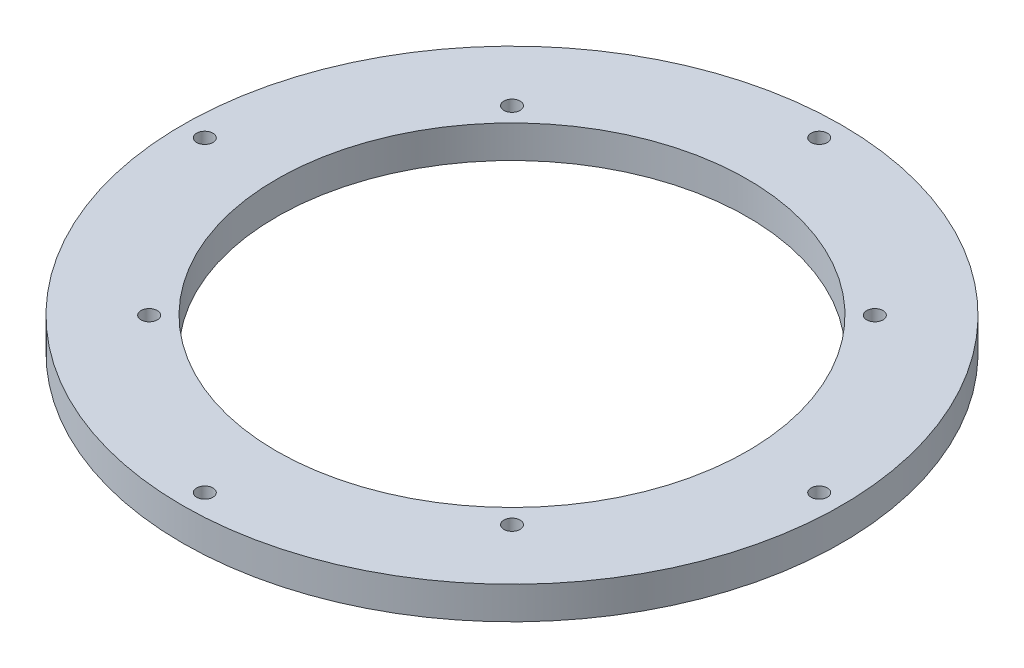
ISO-10303-21;
HEADER;
FILE_DESCRIPTION(('STEP AP214'),'2;1');
FILE_NAME('part.step','',(''),(''),'','','');
FILE_SCHEMA(('AUTOMOTIVE_DESIGN { 1 0 10303 214 1 1 1 1 }'));
ENDSEC;
DATA;
#1=APPLICATION_CONTEXT('core data for automotive mechanical design processes');
#2=APPLICATION_PROTOCOL_DEFINITION('international standard','automotive_design',2000,#1);
#3=PRODUCT_CONTEXT('',#1,'mechanical');
#4=PRODUCT('Part','Part','',(#3));
#5=PRODUCT_RELATED_PRODUCT_CATEGORY('part','',(#4));
#6=PRODUCT_DEFINITION_FORMATION('','',#4);
#7=PRODUCT_DEFINITION_CONTEXT('part definition',#1,'design');
#8=PRODUCT_DEFINITION('design','',#6,#7);
#9=PRODUCT_DEFINITION_SHAPE('','',#8);
#10=(LENGTH_UNIT() NAMED_UNIT(*) SI_UNIT(.MILLI.,.METRE.));
#11=(NAMED_UNIT(*) PLANE_ANGLE_UNIT() SI_UNIT($,.RADIAN.));
#12=(NAMED_UNIT(*) SI_UNIT($,.STERADIAN.) SOLID_ANGLE_UNIT());
#13=UNCERTAINTY_MEASURE_WITH_UNIT(LENGTH_MEASURE(1.E-05),#10,'distance_accuracy_value','');
#14=(GEOMETRIC_REPRESENTATION_CONTEXT(3) GLOBAL_UNCERTAINTY_ASSIGNED_CONTEXT((#13)) GLOBAL_UNIT_ASSIGNED_CONTEXT((#10,
#11,#12)) REPRESENTATION_CONTEXT('',''));
#15=CARTESIAN_POINT('',(0.,0.,0.));
#16=DIRECTION('',(0.,0.,1.));
#17=DIRECTION('',(1.,0.,0.));
#18=AXIS2_PLACEMENT_3D('',#15,#16,#17);
#19=CARTESIAN_POINT('',(0.,10.,0.));
#20=DIRECTION('',(0.,1.,0.));
#21=DIRECTION('',(0.,0.,1.));
#22=AXIS2_PLACEMENT_3D('',#19,#20,#21);
#23=PLANE('',#22);
#24=CARTESIAN_POINT('',(0.,10.,-94.385));
#25=DIRECTION('',(0.,1.,0.));
#26=DIRECTION('',(0.,0.,1.));
#27=AXIS2_PLACEMENT_3D('',#24,#25,#26);
#28=CIRCLE('',#27,2.5);
#29=CARTESIAN_POINT('',(0.,10.,-91.885));
#30=VERTEX_POINT('',#29);
#31=EDGE_CURVE('E83',#30,#30,#28,.T.);
#32=ORIENTED_EDGE('',*,*,#31,.F.);
#33=EDGE_LOOP('',(#32));
#34=FACE_BOUND('',#33,.T.);
#35=CARTESIAN_POINT('',(-55.7412275609351,10.,-55.741227560936));
#36=DIRECTION('',(0.,1.,0.));
#37=DIRECTION('',(0.,0.,1.));
#38=AXIS2_PLACEMENT_3D('',#35,#36,#37);
#39=CIRCLE('',#38,2.5);
#40=CARTESIAN_POINT('',(-55.7412275609351,10.,-53.241227560936));
#41=VERTEX_POINT('',#40);
#42=EDGE_CURVE('E87',#41,#41,#39,.T.);
#43=ORIENTED_EDGE('',*,*,#42,.F.);
#44=EDGE_LOOP('',(#43));
#45=FACE_BOUND('',#44,.T.);
#46=CARTESIAN_POINT('',(-55.7412275609358,10.,55.7412275609353));
#47=DIRECTION('',(0.,1.,0.));
#48=DIRECTION('',(0.,0.,1.));
#49=AXIS2_PLACEMENT_3D('',#46,#47,#48);
#50=CIRCLE('',#49,2.5);
#51=CARTESIAN_POINT('',(-55.7412275609358,10.,58.2412275609353));
#52=VERTEX_POINT('',#51);
#53=EDGE_CURVE('E93',#52,#52,#50,.T.);
#54=ORIENTED_EDGE('',*,*,#53,.F.);
#55=EDGE_LOOP('',(#54));
#56=FACE_BOUND('',#55,.T.);
#57=CARTESIAN_POINT('',(55.7412275609354,10.,55.7412275609356));
#58=DIRECTION('',(0.,1.,0.));
#59=DIRECTION('',(0.,0.,1.));
#60=AXIS2_PLACEMENT_3D('',#57,#58,#59);
#61=CIRCLE('',#60,2.5);
#62=CARTESIAN_POINT('',(55.7412275609354,10.,58.2412275609356));
#63=VERTEX_POINT('',#62);
#64=EDGE_CURVE('E62',#63,#63,#61,.T.);
#65=ORIENTED_EDGE('',*,*,#64,.F.);
#66=EDGE_LOOP('',(#65));
#67=FACE_BOUND('',#66,.T.);
#68=CARTESIAN_POINT('',(-94.385,10.,-9.88630398500128E-13));
#69=DIRECTION('',(0.,1.,0.));
#70=DIRECTION('',(0.,0.,1.));
#71=AXIS2_PLACEMENT_3D('',#68,#69,#70);
#72=CIRCLE('',#71,2.5);
#73=CARTESIAN_POINT('',(-94.385,10.,2.49999999999901));
#74=VERTEX_POINT('',#73);
#75=EDGE_CURVE('E61',#74,#74,#72,.T.);
#76=ORIENTED_EDGE('',*,*,#75,.F.);
#77=EDGE_LOOP('',(#76));
#78=FACE_BOUND('',#77,.T.);
#79=CARTESIAN_POINT('',(-6.59086932333418E-13,10.,94.385));
#80=DIRECTION('',(0.,1.,0.));
#81=DIRECTION('',(0.,0.,1.));
#82=AXIS2_PLACEMENT_3D('',#79,#80,#81);
#83=CIRCLE('',#82,2.5);
#84=CARTESIAN_POINT('',(-6.59086932333418E-13,10.,96.885));
#85=VERTEX_POINT('',#84);
#86=EDGE_CURVE('E68',#85,#85,#83,.T.);
#87=ORIENTED_EDGE('',*,*,#86,.F.);
#88=EDGE_LOOP('',(#87));
#89=FACE_BOUND('',#88,.T.);
#90=CARTESIAN_POINT('',(94.385,10.,3.29543466166709E-13));
#91=DIRECTION('',(0.,1.,0.));
#92=DIRECTION('',(0.,0.,1.));
#93=AXIS2_PLACEMENT_3D('',#90,#91,#92);
#94=CIRCLE('',#93,2.5);
#95=CARTESIAN_POINT('',(94.385,10.,2.50000000000033));
#96=VERTEX_POINT('',#95);
#97=EDGE_CURVE('E74',#96,#96,#94,.T.);
#98=ORIENTED_EDGE('',*,*,#97,.F.);
#99=EDGE_LOOP('',(#98));
#100=FACE_BOUND('',#99,.T.);
#101=CARTESIAN_POINT('',(55.7412275609354,10.,-55.7412275609356));
#102=DIRECTION('',(0.,1.,0.));
#103=DIRECTION('',(0.,0.,1.));
#104=AXIS2_PLACEMENT_3D('',#101,#102,#103);
#105=CIRCLE('',#104,2.5);
#106=CARTESIAN_POINT('',(55.7412275609354,10.,-53.2412275609356));
#107=VERTEX_POINT('',#106);
#108=EDGE_CURVE('E80',#107,#107,#105,.T.);
#109=ORIENTED_EDGE('',*,*,#108,.F.);
#110=EDGE_LOOP('',(#109));
#111=FACE_BOUND('',#110,.T.);
#112=CARTESIAN_POINT('',(0.,10.,0.));
#113=DIRECTION('',(0.,1.,0.));
#114=DIRECTION('',(0.,0.,1.));
#115=AXIS2_PLACEMENT_3D('',#112,#113,#114);
#116=CIRCLE('',#115,101.25);
#117=CARTESIAN_POINT('',(0.,10.,101.25));
#118=VERTEX_POINT('',#117);
#119=EDGE_CURVE('E10',#118,#118,#116,.T.);
#120=ORIENTED_EDGE('',*,*,#119,.T.);
#121=EDGE_LOOP('',(#120));
#122=FACE_BOUND('',#121,.T.);
#123=CARTESIAN_POINT('',(0.,10.,0.));
#124=DIRECTION('',(0.,1.,0.));
#125=DIRECTION('',(0.,0.,1.));
#126=AXIS2_PLACEMENT_3D('',#123,#124,#125);
#127=CIRCLE('',#126,72.35);
#128=CARTESIAN_POINT('',(0.,10.,72.35));
#129=VERTEX_POINT('',#128);
#130=EDGE_CURVE('E50',#129,#129,#127,.T.);
#131=ORIENTED_EDGE('',*,*,#130,.F.);
#132=EDGE_LOOP('',(#131));
#133=FACE_BOUND('',#132,.T.);
#134=ADVANCED_FACE('F39',(#34,#45,#56,#67,#78,#89,#100,#111,#122,#133),#23,.T.);
#135=CARTESIAN_POINT('',(0.,0.,0.));
#136=DIRECTION('',(0.,1.,0.));
#137=DIRECTION('',(0.,0.,1.));
#138=AXIS2_PLACEMENT_3D('',#135,#136,#137);
#139=PLANE('',#138);
#140=CARTESIAN_POINT('',(0.,0.,-94.385));
#141=DIRECTION('',(0.,1.,0.));
#142=DIRECTION('',(0.,0.,1.));
#143=AXIS2_PLACEMENT_3D('',#140,#141,#142);
#144=CIRCLE('',#143,2.5);
#145=CARTESIAN_POINT('',(0.,0.,-91.885));
#146=VERTEX_POINT('',#145);
#147=EDGE_CURVE('E55',#146,#146,#144,.T.);
#148=ORIENTED_EDGE('',*,*,#147,.T.);
#149=EDGE_LOOP('',(#148));
#150=FACE_BOUND('',#149,.T.);
#151=CARTESIAN_POINT('',(-55.7412275609351,0.,-55.741227560936));
#152=DIRECTION('',(0.,1.,0.));
#153=DIRECTION('',(0.,0.,1.));
#154=AXIS2_PLACEMENT_3D('',#151,#152,#153);
#155=CIRCLE('',#154,2.5);
#156=CARTESIAN_POINT('',(-55.7412275609351,0.,-53.241227560936));
#157=VERTEX_POINT('',#156);
#158=EDGE_CURVE('E84',#157,#157,#155,.T.);
#159=ORIENTED_EDGE('',*,*,#158,.T.);
#160=EDGE_LOOP('',(#159));
#161=FACE_BOUND('',#160,.T.);
#162=CARTESIAN_POINT('',(-55.7412275609358,0.,55.7412275609353));
#163=DIRECTION('',(0.,1.,0.));
#164=DIRECTION('',(0.,0.,1.));
#165=AXIS2_PLACEMENT_3D('',#162,#163,#164);
#166=CIRCLE('',#165,2.5);
#167=CARTESIAN_POINT('',(-55.7412275609358,0.,58.2412275609353));
#168=VERTEX_POINT('',#167);
#169=EDGE_CURVE('E90',#168,#168,#166,.T.);
#170=ORIENTED_EDGE('',*,*,#169,.T.);
#171=EDGE_LOOP('',(#170));
#172=FACE_BOUND('',#171,.T.);
#173=CARTESIAN_POINT('',(55.7412275609354,0.,55.7412275609356));
#174=DIRECTION('',(0.,1.,0.));
#175=DIRECTION('',(0.,0.,1.));
#176=AXIS2_PLACEMENT_3D('',#173,#174,#175);
#177=CIRCLE('',#176,2.5);
#178=CARTESIAN_POINT('',(55.7412275609354,0.,58.2412275609356));
#179=VERTEX_POINT('',#178);
#180=EDGE_CURVE('E96',#179,#179,#177,.T.);
#181=ORIENTED_EDGE('',*,*,#180,.T.);
#182=EDGE_LOOP('',(#181));
#183=FACE_BOUND('',#182,.T.);
#184=CARTESIAN_POINT('',(-94.385,0.,-9.88630398500128E-13));
#185=DIRECTION('',(0.,1.,0.));
#186=DIRECTION('',(0.,0.,1.));
#187=AXIS2_PLACEMENT_3D('',#184,#185,#186);
#188=CIRCLE('',#187,2.5);
#189=CARTESIAN_POINT('',(-94.385,0.,2.49999999999901));
#190=VERTEX_POINT('',#189);
#191=EDGE_CURVE('E58',#190,#190,#188,.T.);
#192=ORIENTED_EDGE('',*,*,#191,.T.);
#193=EDGE_LOOP('',(#192));
#194=FACE_BOUND('',#193,.T.);
#195=CARTESIAN_POINT('',(-6.59086932333418E-13,0.,94.385));
#196=DIRECTION('',(0.,1.,0.));
#197=DIRECTION('',(0.,0.,1.));
#198=AXIS2_PLACEMENT_3D('',#195,#196,#197);
#199=CIRCLE('',#198,2.5);
#200=CARTESIAN_POINT('',(-6.59086932333418E-13,0.,96.885));
#201=VERTEX_POINT('',#200);
#202=EDGE_CURVE('E65',#201,#201,#199,.T.);
#203=ORIENTED_EDGE('',*,*,#202,.T.);
#204=EDGE_LOOP('',(#203));
#205=FACE_BOUND('',#204,.T.);
#206=CARTESIAN_POINT('',(94.385,0.,3.29543466166709E-13));
#207=DIRECTION('',(0.,1.,0.));
#208=DIRECTION('',(0.,0.,1.));
#209=AXIS2_PLACEMENT_3D('',#206,#207,#208);
#210=CIRCLE('',#209,2.5);
#211=CARTESIAN_POINT('',(94.385,0.,2.50000000000033));
#212=VERTEX_POINT('',#211);
#213=EDGE_CURVE('E71',#212,#212,#210,.T.);
#214=ORIENTED_EDGE('',*,*,#213,.T.);
#215=EDGE_LOOP('',(#214));
#216=FACE_BOUND('',#215,.T.);
#217=CARTESIAN_POINT('',(55.7412275609354,0.,-55.7412275609356));
#218=DIRECTION('',(0.,1.,0.));
#219=DIRECTION('',(0.,0.,1.));
#220=AXIS2_PLACEMENT_3D('',#217,#218,#219);
#221=CIRCLE('',#220,2.5);
#222=CARTESIAN_POINT('',(55.7412275609354,0.,-53.2412275609356));
#223=VERTEX_POINT('',#222);
#224=EDGE_CURVE('E77',#223,#223,#221,.T.);
#225=ORIENTED_EDGE('',*,*,#224,.T.);
#226=EDGE_LOOP('',(#225));
#227=FACE_BOUND('',#226,.T.);
#228=CARTESIAN_POINT('',(0.,0.,0.));
#229=DIRECTION('',(0.,1.,0.));
#230=DIRECTION('',(0.,0.,1.));
#231=AXIS2_PLACEMENT_3D('',#228,#229,#230);
#232=CIRCLE('',#231,101.25);
#233=CARTESIAN_POINT('',(0.,0.,101.25));
#234=VERTEX_POINT('',#233);
#235=EDGE_CURVE('E43',#234,#234,#232,.T.);
#236=ORIENTED_EDGE('',*,*,#235,.F.);
#237=EDGE_LOOP('',(#236));
#238=FACE_BOUND('',#237,.T.);
#239=CARTESIAN_POINT('',(0.,0.,0.));
#240=DIRECTION('',(0.,1.,0.));
#241=DIRECTION('',(0.,0.,1.));
#242=AXIS2_PLACEMENT_3D('',#239,#240,#241);
#243=CIRCLE('',#242,72.35);
#244=CARTESIAN_POINT('',(0.,0.,72.35));
#245=VERTEX_POINT('',#244);
#246=EDGE_CURVE('E52',#245,#245,#243,.T.);
#247=ORIENTED_EDGE('',*,*,#246,.T.);
#248=EDGE_LOOP('',(#247));
#249=FACE_BOUND('',#248,.T.);
#250=ADVANCED_FACE('F106',(#150,#161,#172,#183,#194,#205,#216,#227,#238,#249),#139,.F.);
#251=CARTESIAN_POINT('',(0.,10.,0.));
#252=DIRECTION('',(0.,-1.,0.));
#253=DIRECTION('',(0.,0.,-1.));
#254=AXIS2_PLACEMENT_3D('',#251,#252,#253);
#255=CYLINDRICAL_SURFACE('',#254,101.25);
#256=ORIENTED_EDGE('',*,*,#119,.F.);
#257=EDGE_LOOP('',(#256));
#258=FACE_BOUND('',#257,.T.);
#259=ORIENTED_EDGE('',*,*,#235,.T.);
#260=EDGE_LOOP('',(#259));
#261=FACE_BOUND('',#260,.T.);
#262=ADVANCED_FACE('F41',(#258,#261),#255,.T.);
#263=CARTESIAN_POINT('',(0.,10.,0.));
#264=DIRECTION('',(0.,-1.,0.));
#265=DIRECTION('',(0.,0.,-1.));
#266=AXIS2_PLACEMENT_3D('',#263,#264,#265);
#267=CYLINDRICAL_SURFACE('',#266,72.35);
#268=ORIENTED_EDGE('',*,*,#130,.T.);
#269=EDGE_LOOP('',(#268));
#270=FACE_BOUND('',#269,.T.);
#271=ORIENTED_EDGE('',*,*,#246,.F.);
#272=EDGE_LOOP('',(#271));
#273=FACE_BOUND('',#272,.T.);
#274=ADVANCED_FACE('F135',(#270,#273),#267,.F.);
#275=CARTESIAN_POINT('',(55.7412275609354,0.,-55.7412275609356));
#276=DIRECTION('',(0.,1.,0.));
#277=DIRECTION('',(0.,0.,1.));
#278=AXIS2_PLACEMENT_3D('',#275,#276,#277);
#279=CYLINDRICAL_SURFACE('',#278,2.5);
#280=ORIENTED_EDGE('',*,*,#224,.F.);
#281=EDGE_LOOP('',(#280));
#282=FACE_BOUND('',#281,.T.);
#283=ORIENTED_EDGE('',*,*,#108,.T.);
#284=EDGE_LOOP('',(#283));
#285=FACE_BOUND('',#284,.T.);
#286=ADVANCED_FACE('F138',(#282,#285),#279,.F.);
#287=CARTESIAN_POINT('',(94.385,0.,3.29543466166709E-13));
#288=DIRECTION('',(0.,1.,0.));
#289=DIRECTION('',(0.,0.,1.));
#290=AXIS2_PLACEMENT_3D('',#287,#288,#289);
#291=CYLINDRICAL_SURFACE('',#290,2.5);
#292=ORIENTED_EDGE('',*,*,#213,.F.);
#293=EDGE_LOOP('',(#292));
#294=FACE_BOUND('',#293,.T.);
#295=ORIENTED_EDGE('',*,*,#97,.T.);
#296=EDGE_LOOP('',(#295));
#297=FACE_BOUND('',#296,.T.);
#298=ADVANCED_FACE('F157',(#294,#297),#291,.F.);
#299=CARTESIAN_POINT('',(-6.59086932333418E-13,0.,94.385));
#300=DIRECTION('',(0.,1.,0.));
#301=DIRECTION('',(0.,0.,1.));
#302=AXIS2_PLACEMENT_3D('',#299,#300,#301);
#303=CYLINDRICAL_SURFACE('',#302,2.5);
#304=ORIENTED_EDGE('',*,*,#202,.F.);
#305=EDGE_LOOP('',(#304));
#306=FACE_BOUND('',#305,.T.);
#307=ORIENTED_EDGE('',*,*,#86,.T.);
#308=EDGE_LOOP('',(#307));
#309=FACE_BOUND('',#308,.T.);
#310=ADVANCED_FACE('F153',(#306,#309),#303,.F.);
#311=CARTESIAN_POINT('',(-94.385,0.,-9.88630398500128E-13));
#312=DIRECTION('',(0.,1.,0.));
#313=DIRECTION('',(0.,0.,1.));
#314=AXIS2_PLACEMENT_3D('',#311,#312,#313);
#315=CYLINDRICAL_SURFACE('',#314,2.5);
#316=ORIENTED_EDGE('',*,*,#191,.F.);
#317=EDGE_LOOP('',(#316));
#318=FACE_BOUND('',#317,.T.);
#319=ORIENTED_EDGE('',*,*,#75,.T.);
#320=EDGE_LOOP('',(#319));
#321=FACE_BOUND('',#320,.T.);
#322=ADVANCED_FACE('F149',(#318,#321),#315,.F.);
#323=CARTESIAN_POINT('',(55.7412275609354,0.,55.7412275609356));
#324=DIRECTION('',(0.,1.,0.));
#325=DIRECTION('',(0.,0.,1.));
#326=AXIS2_PLACEMENT_3D('',#323,#324,#325);
#327=CYLINDRICAL_SURFACE('',#326,2.5);
#328=ORIENTED_EDGE('',*,*,#180,.F.);
#329=EDGE_LOOP('',(#328));
#330=FACE_BOUND('',#329,.T.);
#331=ORIENTED_EDGE('',*,*,#64,.T.);
#332=EDGE_LOOP('',(#331));
#333=FACE_BOUND('',#332,.T.);
#334=ADVANCED_FACE('F152',(#330,#333),#327,.F.);
#335=CARTESIAN_POINT('',(-55.7412275609358,0.,55.7412275609353));
#336=DIRECTION('',(0.,1.,0.));
#337=DIRECTION('',(0.,0.,1.));
#338=AXIS2_PLACEMENT_3D('',#335,#336,#337);
#339=CYLINDRICAL_SURFACE('',#338,2.5);
#340=ORIENTED_EDGE('',*,*,#169,.F.);
#341=EDGE_LOOP('',(#340));
#342=FACE_BOUND('',#341,.T.);
#343=ORIENTED_EDGE('',*,*,#53,.T.);
#344=EDGE_LOOP('',(#343));
#345=FACE_BOUND('',#344,.T.);
#346=ADVANCED_FACE('F166',(#342,#345),#339,.F.);
#347=CARTESIAN_POINT('',(-55.7412275609351,0.,-55.741227560936));
#348=DIRECTION('',(0.,1.,0.));
#349=DIRECTION('',(0.,0.,1.));
#350=AXIS2_PLACEMENT_3D('',#347,#348,#349);
#351=CYLINDRICAL_SURFACE('',#350,2.5);
#352=ORIENTED_EDGE('',*,*,#158,.F.);
#353=EDGE_LOOP('',(#352));
#354=FACE_BOUND('',#353,.T.);
#355=ORIENTED_EDGE('',*,*,#42,.T.);
#356=EDGE_LOOP('',(#355));
#357=FACE_BOUND('',#356,.T.);
#358=ADVANCED_FACE('F112',(#354,#357),#351,.F.);
#359=CARTESIAN_POINT('',(0.,0.,-94.385));
#360=DIRECTION('',(0.,1.,0.));
#361=DIRECTION('',(0.,0.,1.));
#362=AXIS2_PLACEMENT_3D('',#359,#360,#361);
#363=CYLINDRICAL_SURFACE('',#362,2.5);
#364=ORIENTED_EDGE('',*,*,#147,.F.);
#365=EDGE_LOOP('',(#364));
#366=FACE_BOUND('',#365,.T.);
#367=ORIENTED_EDGE('',*,*,#31,.T.);
#368=EDGE_LOOP('',(#367));
#369=FACE_BOUND('',#368,.T.);
#370=ADVANCED_FACE('F109',(#366,#369),#363,.F.);
#371=CLOSED_SHELL('',(#134,#250,#262,#274,#286,#298,#310,#322,#334,#346,#358,#370));
#372=MANIFOLD_SOLID_BREP('B2',#371);
#373=ADVANCED_BREP_SHAPE_REPRESENTATION('',(#18,#372),#14);
#374=SHAPE_DEFINITION_REPRESENTATION(#9,#373);
ENDSEC;
END-ISO-10303-21;
